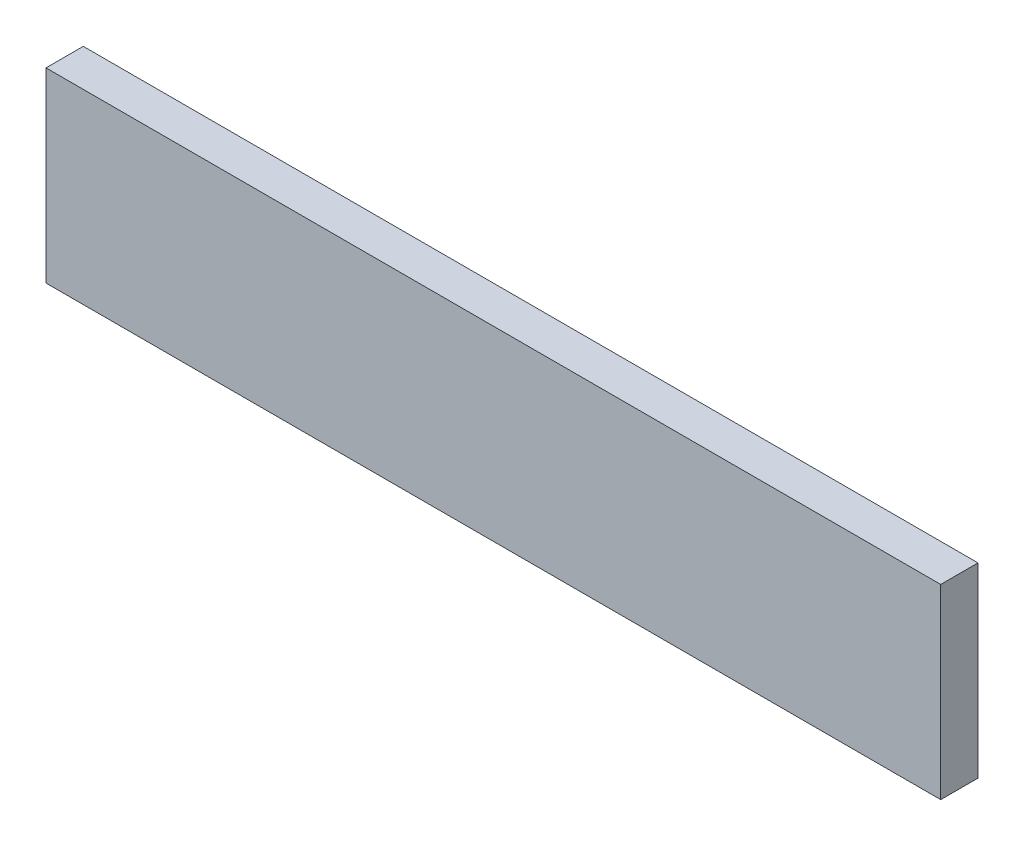
ISO-10303-21;
HEADER;
FILE_DESCRIPTION(('STEP AP214'),'2;1');
FILE_NAME('part.step','',(''),(''),'','','');
FILE_SCHEMA(('AUTOMOTIVE_DESIGN { 1 0 10303 214 1 1 1 1 }'));
ENDSEC;
DATA;
#1=APPLICATION_CONTEXT('core data for automotive mechanical design processes');
#2=APPLICATION_PROTOCOL_DEFINITION('international standard','automotive_design',2000,#1);
#3=PRODUCT_CONTEXT('',#1,'mechanical');
#4=PRODUCT('Part','Part','',(#3));
#5=PRODUCT_RELATED_PRODUCT_CATEGORY('part','',(#4));
#6=PRODUCT_DEFINITION_FORMATION('','',#4);
#7=PRODUCT_DEFINITION_CONTEXT('part definition',#1,'design');
#8=PRODUCT_DEFINITION('design','',#6,#7);
#9=PRODUCT_DEFINITION_SHAPE('','',#8);
#10=(LENGTH_UNIT() NAMED_UNIT(*) SI_UNIT(.MILLI.,.METRE.));
#11=(NAMED_UNIT(*) PLANE_ANGLE_UNIT() SI_UNIT($,.RADIAN.));
#12=(NAMED_UNIT(*) SI_UNIT($,.STERADIAN.) SOLID_ANGLE_UNIT());
#13=UNCERTAINTY_MEASURE_WITH_UNIT(LENGTH_MEASURE(1.E-05),#10,'distance_accuracy_value','');
#14=(GEOMETRIC_REPRESENTATION_CONTEXT(3) GLOBAL_UNCERTAINTY_ASSIGNED_CONTEXT((#13)) GLOBAL_UNIT_ASSIGNED_CONTEXT((#10,
#11,#12)) REPRESENTATION_CONTEXT('',''));
#15=CARTESIAN_POINT('',(0.,0.,0.));
#16=DIRECTION('',(0.,0.,1.));
#17=DIRECTION('',(1.,0.,0.));
#18=AXIS2_PLACEMENT_3D('',#15,#16,#17);
#19=CARTESIAN_POINT('',(76.2,-15.875,-6.35));
#20=DIRECTION('',(1.,0.,0.));
#21=DIRECTION('',(0.,0.,-1.));
#22=AXIS2_PLACEMENT_3D('',#19,#20,#21);
#23=PLANE('',#22);
#24=DIRECTION('',(0.,1.,0.));
#25=VECTOR('',#24,1.);
#26=CARTESIAN_POINT('',(76.2,-15.875,0.));
#27=LINE('',#26,#25);
#28=CARTESIAN_POINT('',(76.2,-15.875,0.));
#29=VERTEX_POINT('',#28);
#30=CARTESIAN_POINT('',(76.2,15.875,0.));
#31=VERTEX_POINT('',#30);
#32=EDGE_CURVE('E97',#29,#31,#27,.T.);
#33=ORIENTED_EDGE('',*,*,#32,.F.);
#34=DIRECTION('',(0.,0.,1.));
#35=VECTOR('',#34,1.);
#36=CARTESIAN_POINT('',(76.2,-15.875,-6.35));
#37=LINE('',#36,#35);
#38=CARTESIAN_POINT('',(76.2,-15.875,-6.35));
#39=VERTEX_POINT('',#38);
#40=EDGE_CURVE('E11',#39,#29,#37,.T.);
#41=ORIENTED_EDGE('',*,*,#40,.F.);
#42=DIRECTION('',(0.,1.,0.));
#43=VECTOR('',#42,1.);
#44=CARTESIAN_POINT('',(76.2,-15.875,-6.35));
#45=LINE('',#44,#43);
#46=CARTESIAN_POINT('',(76.2,15.875,-6.35));
#47=VERTEX_POINT('',#46);
#48=EDGE_CURVE('E91',#39,#47,#45,.T.);
#49=ORIENTED_EDGE('',*,*,#48,.T.);
#50=DIRECTION('',(0.,0.,1.));
#51=VECTOR('',#50,1.);
#52=CARTESIAN_POINT('',(76.2,15.875,-6.35));
#53=LINE('',#52,#51);
#54=EDGE_CURVE('E36',#47,#31,#53,.T.);
#55=ORIENTED_EDGE('',*,*,#54,.T.);
#56=EDGE_LOOP('',(#33,#41,#49,#55));
#57=FACE_BOUND('',#56,.T.);
#58=ADVANCED_FACE('F33',(#57),#23,.T.);
#59=CARTESIAN_POINT('',(-76.2,-15.875,-6.35));
#60=DIRECTION('',(0.,-1.,0.));
#61=DIRECTION('',(0.,0.,-1.));
#62=AXIS2_PLACEMENT_3D('',#59,#60,#61);
#63=PLANE('',#62);
#64=DIRECTION('',(1.,0.,0.));
#65=VECTOR('',#64,1.);
#66=CARTESIAN_POINT('',(-76.2,-15.875,0.));
#67=LINE('',#66,#65);
#68=CARTESIAN_POINT('',(-76.2,-15.875,0.));
#69=VERTEX_POINT('',#68);
#70=EDGE_CURVE('E93',#69,#29,#67,.T.);
#71=ORIENTED_EDGE('',*,*,#70,.F.);
#72=DIRECTION('',(0.,0.,1.));
#73=VECTOR('',#72,1.);
#74=CARTESIAN_POINT('',(-76.2,-15.875,-6.35));
#75=LINE('',#74,#73);
#76=CARTESIAN_POINT('',(-76.2,-15.875,-6.35));
#77=VERTEX_POINT('',#76);
#78=EDGE_CURVE('E42',#77,#69,#75,.T.);
#79=ORIENTED_EDGE('',*,*,#78,.F.);
#80=DIRECTION('',(1.,0.,0.));
#81=VECTOR('',#80,1.);
#82=CARTESIAN_POINT('',(-76.2,-15.875,-6.35));
#83=LINE('',#82,#81);
#84=EDGE_CURVE('E88',#77,#39,#83,.T.);
#85=ORIENTED_EDGE('',*,*,#84,.T.);
#86=ORIENTED_EDGE('',*,*,#40,.T.);
#87=EDGE_LOOP('',(#71,#79,#85,#86));
#88=FACE_BOUND('',#87,.T.);
#89=ADVANCED_FACE('F107',(#88),#63,.T.);
#90=CARTESIAN_POINT('',(-76.2,-15.875,-6.35));
#91=DIRECTION('',(-1.,0.,0.));
#92=DIRECTION('',(0.,0.,1.));
#93=AXIS2_PLACEMENT_3D('',#90,#91,#92);
#94=PLANE('',#93);
#95=DIRECTION('',(0.,-1.,0.));
#96=VECTOR('',#95,1.);
#97=CARTESIAN_POINT('',(-76.2,-15.875,0.));
#98=LINE('',#97,#96);
#99=CARTESIAN_POINT('',(-76.2,15.875,0.));
#100=VERTEX_POINT('',#99);
#101=EDGE_CURVE('E83',#100,#69,#98,.T.);
#102=ORIENTED_EDGE('',*,*,#101,.F.);
#103=DIRECTION('',(0.,0.,1.));
#104=VECTOR('',#103,1.);
#105=CARTESIAN_POINT('',(-76.2,15.875,-6.35));
#106=LINE('',#105,#104);
#107=CARTESIAN_POINT('',(-76.2,15.875,-6.35));
#108=VERTEX_POINT('',#107);
#109=EDGE_CURVE('E78',#108,#100,#106,.T.);
#110=ORIENTED_EDGE('',*,*,#109,.F.);
#111=DIRECTION('',(0.,-1.,0.));
#112=VECTOR('',#111,1.);
#113=CARTESIAN_POINT('',(-76.2,-15.875,-6.35));
#114=LINE('',#113,#112);
#115=EDGE_CURVE('E81',#108,#77,#114,.T.);
#116=ORIENTED_EDGE('',*,*,#115,.T.);
#117=ORIENTED_EDGE('',*,*,#78,.T.);
#118=EDGE_LOOP('',(#102,#110,#116,#117));
#119=FACE_BOUND('',#118,.T.);
#120=ADVANCED_FACE('F80',(#119),#94,.T.);
#121=CARTESIAN_POINT('',(-76.2,15.875,-6.35));
#122=DIRECTION('',(0.,1.,0.));
#123=DIRECTION('',(0.,0.,1.));
#124=AXIS2_PLACEMENT_3D('',#121,#122,#123);
#125=PLANE('',#124);
#126=DIRECTION('',(-1.,0.,0.));
#127=VECTOR('',#126,1.);
#128=CARTESIAN_POINT('',(-76.2,15.875,0.));
#129=LINE('',#128,#127);
#130=EDGE_CURVE('E100',#31,#100,#129,.T.);
#131=ORIENTED_EDGE('',*,*,#130,.F.);
#132=ORIENTED_EDGE('',*,*,#54,.F.);
#133=DIRECTION('',(-1.,0.,0.));
#134=VECTOR('',#133,1.);
#135=CARTESIAN_POINT('',(-76.2,15.875,-6.35));
#136=LINE('',#135,#134);
#137=EDGE_CURVE('E87',#47,#108,#136,.T.);
#138=ORIENTED_EDGE('',*,*,#137,.T.);
#139=ORIENTED_EDGE('',*,*,#109,.T.);
#140=EDGE_LOOP('',(#131,#132,#138,#139));
#141=FACE_BOUND('',#140,.T.);
#142=ADVANCED_FACE('F90',(#141),#125,.T.);
#143=CARTESIAN_POINT('',(0.,0.,-6.35));
#144=DIRECTION('',(0.,0.,-1.));
#145=DIRECTION('',(-1.,0.,0.));
#146=AXIS2_PLACEMENT_3D('',#143,#144,#145);
#147=PLANE('',#146);
#148=ORIENTED_EDGE('',*,*,#48,.F.);
#149=ORIENTED_EDGE('',*,*,#84,.F.);
#150=ORIENTED_EDGE('',*,*,#115,.F.);
#151=ORIENTED_EDGE('',*,*,#137,.F.);
#152=EDGE_LOOP('',(#148,#149,#150,#151));
#153=FACE_BOUND('',#152,.T.);
#154=ADVANCED_FACE('F86',(#153),#147,.T.);
#155=CARTESIAN_POINT('',(0.,0.,0.));
#156=DIRECTION('',(0.,0.,-1.));
#157=DIRECTION('',(-1.,0.,0.));
#158=AXIS2_PLACEMENT_3D('',#155,#156,#157);
#159=PLANE('',#158);
#160=ORIENTED_EDGE('',*,*,#32,.T.);
#161=ORIENTED_EDGE('',*,*,#130,.T.);
#162=ORIENTED_EDGE('',*,*,#101,.T.);
#163=ORIENTED_EDGE('',*,*,#70,.T.);
#164=EDGE_LOOP('',(#160,#161,#162,#163));
#165=FACE_BOUND('',#164,.T.);
#166=ADVANCED_FACE('F106',(#165),#159,.F.);
#167=CLOSED_SHELL('',(#58,#89,#120,#142,#154,#166));
#168=MANIFOLD_SOLID_BREP('B2',#167);
#169=ADVANCED_BREP_SHAPE_REPRESENTATION('',(#18,#168),#14);
#170=SHAPE_DEFINITION_REPRESENTATION(#9,#169);
ENDSEC;
END-ISO-10303-21;
